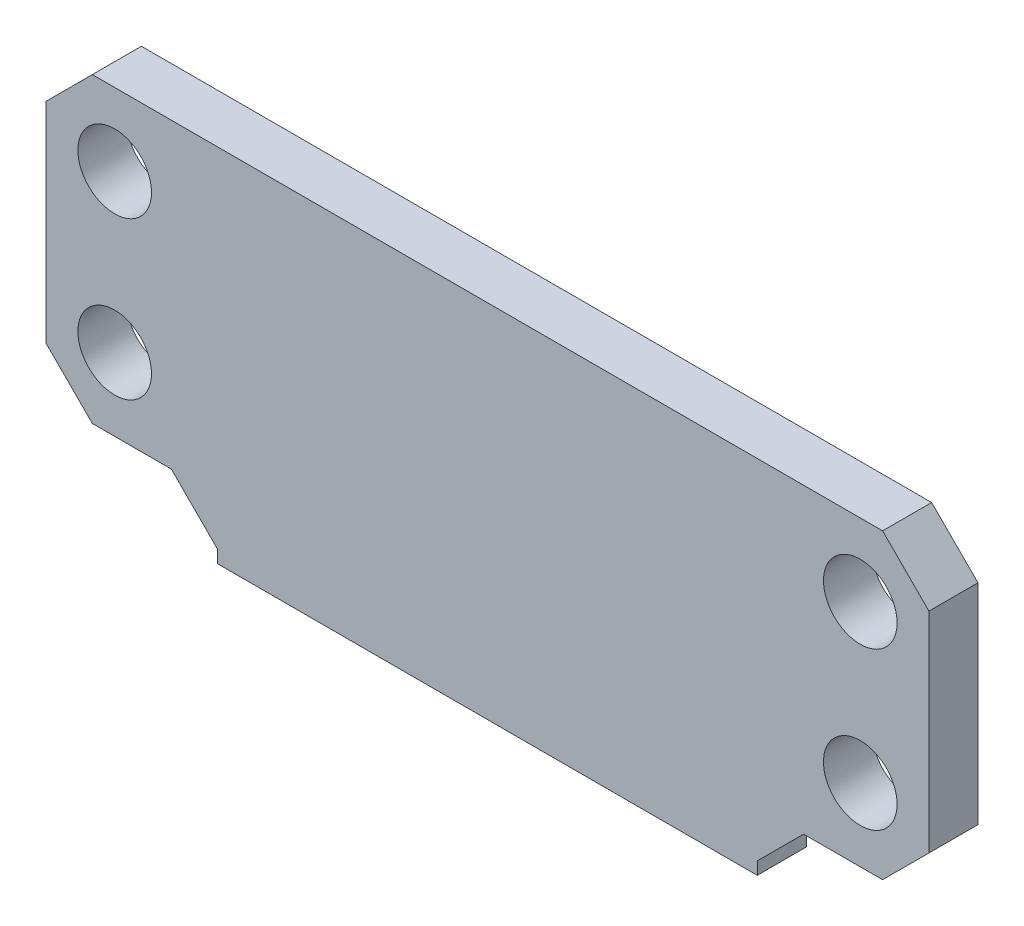
ISO-10303-21;
HEADER;
FILE_DESCRIPTION(('STEP AP214'),'2;1');
FILE_NAME('part.step','',(''),(''),'','','');
FILE_SCHEMA(('AUTOMOTIVE_DESIGN { 1 0 10303 214 1 1 1 1 }'));
ENDSEC;
DATA;
#1=APPLICATION_CONTEXT('core data for automotive mechanical design processes');
#2=APPLICATION_PROTOCOL_DEFINITION('international standard','automotive_design',2000,#1);
#3=PRODUCT_CONTEXT('',#1,'mechanical');
#4=PRODUCT('Part','Part','',(#3));
#5=PRODUCT_RELATED_PRODUCT_CATEGORY('part','',(#4));
#6=PRODUCT_DEFINITION_FORMATION('','',#4);
#7=PRODUCT_DEFINITION_CONTEXT('part definition',#1,'design');
#8=PRODUCT_DEFINITION('design','',#6,#7);
#9=PRODUCT_DEFINITION_SHAPE('','',#8);
#10=(LENGTH_UNIT() NAMED_UNIT(*) SI_UNIT(.MILLI.,.METRE.));
#11=(NAMED_UNIT(*) PLANE_ANGLE_UNIT() SI_UNIT($,.RADIAN.));
#12=(NAMED_UNIT(*) SI_UNIT($,.STERADIAN.) SOLID_ANGLE_UNIT());
#13=UNCERTAINTY_MEASURE_WITH_UNIT(LENGTH_MEASURE(1.E-05),#10,'distance_accuracy_value','');
#14=(GEOMETRIC_REPRESENTATION_CONTEXT(3) GLOBAL_UNCERTAINTY_ASSIGNED_CONTEXT((#13)) GLOBAL_UNIT_ASSIGNED_CONTEXT((#10,
#11,#12)) REPRESENTATION_CONTEXT('',''));
#15=CARTESIAN_POINT('',(0.,0.,0.));
#16=DIRECTION('',(0.,0.,1.));
#17=DIRECTION('',(1.,0.,0.));
#18=AXIS2_PLACEMENT_3D('',#15,#16,#17);
#19=CARTESIAN_POINT('',(0.,1.65099999999999,3.175));
#20=DIRECTION('',(0.,-1.,0.));
#21=DIRECTION('',(1.,0.,0.));
#22=AXIS2_PLACEMENT_3D('',#19,#20,#21);
#23=PLANE('',#22);
#24=DIRECTION('',(-1.,0.,0.));
#25=VECTOR('',#24,1.);
#26=CARTESIAN_POINT('',(0.,1.65099999999999,0.));
#27=LINE('',#26,#25);
#28=CARTESIAN_POINT('',(-20.4625,1.65099999999999,0.));
#29=VERTEX_POINT('',#28);
#30=CARTESIAN_POINT('',(-25.575,1.65099999999999,0.));
#31=VERTEX_POINT('',#30);
#32=EDGE_CURVE('E156',#29,#31,#27,.T.);
#33=ORIENTED_EDGE('',*,*,#32,.F.);
#34=DIRECTION('',(0.,0.,1.));
#35=VECTOR('',#34,1.);
#36=CARTESIAN_POINT('',(-20.4625,1.65099999999999,3.175));
#37=LINE('',#36,#35);
#38=CARTESIAN_POINT('',(-20.4625,1.65099999999999,3.175));
#39=VERTEX_POINT('',#38);
#40=EDGE_CURVE('E216',#29,#39,#37,.T.);
#41=ORIENTED_EDGE('',*,*,#40,.T.);
#42=DIRECTION('',(-1.,0.,0.));
#43=VECTOR('',#42,1.);
#44=CARTESIAN_POINT('',(0.,1.65099999999999,3.175));
#45=LINE('',#44,#43);
#46=CARTESIAN_POINT('',(-25.575,1.65099999999999,3.175));
#47=VERTEX_POINT('',#46);
#48=EDGE_CURVE('E234',#39,#47,#45,.T.);
#49=ORIENTED_EDGE('',*,*,#48,.T.);
#50=DIRECTION('',(0.,0.,-1.));
#51=VECTOR('',#50,1.);
#52=CARTESIAN_POINT('',(-25.575,1.65099999999999,3.175));
#53=LINE('',#52,#51);
#54=EDGE_CURVE('E205',#47,#31,#53,.T.);
#55=ORIENTED_EDGE('',*,*,#54,.T.);
#56=EDGE_LOOP('',(#33,#41,#49,#55));
#57=FACE_BOUND('',#56,.T.);
#58=ADVANCED_FACE('F32',(#57),#23,.T.);
#59=CARTESIAN_POINT('',(-17.4625,0.,3.175));
#60=DIRECTION('',(-1.,0.,0.));
#61=DIRECTION('',(0.,0.,1.));
#62=AXIS2_PLACEMENT_3D('',#59,#60,#61);
#63=PLANE('',#62);
#64=DIRECTION('',(0.,0.,-1.));
#65=VECTOR('',#64,1.);
#66=CARTESIAN_POINT('',(-17.4625,-2.15900000000001,3.175));
#67=LINE('',#66,#65);
#68=CARTESIAN_POINT('',(-17.4625,-2.15900000000001,3.175));
#69=VERTEX_POINT('',#68);
#70=CARTESIAN_POINT('',(-17.4625,-2.15900000000001,0.));
#71=VERTEX_POINT('',#70);
#72=EDGE_CURVE('E47',#69,#71,#67,.T.);
#73=ORIENTED_EDGE('',*,*,#72,.F.);
#74=DIRECTION('',(0.,1.,0.));
#75=VECTOR('',#74,1.);
#76=CARTESIAN_POINT('',(-17.4625,0.,3.175));
#77=LINE('',#76,#75);
#78=CARTESIAN_POINT('',(-17.4625,-1.34900000000003,3.175));
#79=VERTEX_POINT('',#78);
#80=EDGE_CURVE('E233',#69,#79,#77,.T.);
#81=ORIENTED_EDGE('',*,*,#80,.T.);
#82=DIRECTION('',(0.,0.,-1.));
#83=VECTOR('',#82,1.);
#84=CARTESIAN_POINT('',(-17.4625,-1.34900000000003,0.));
#85=LINE('',#84,#83);
#86=CARTESIAN_POINT('',(-17.4625,-1.34900000000003,0.));
#87=VERTEX_POINT('',#86);
#88=EDGE_CURVE('E213',#79,#87,#85,.T.);
#89=ORIENTED_EDGE('',*,*,#88,.T.);
#90=DIRECTION('',(0.,1.,0.));
#91=VECTOR('',#90,1.);
#92=CARTESIAN_POINT('',(-17.4625,0.,0.));
#93=LINE('',#92,#91);
#94=EDGE_CURVE('E152',#71,#87,#93,.T.);
#95=ORIENTED_EDGE('',*,*,#94,.F.);
#96=EDGE_LOOP('',(#73,#81,#89,#95));
#97=FACE_BOUND('',#96,.T.);
#98=ADVANCED_FACE('F240',(#97),#63,.T.);
#99=CARTESIAN_POINT('',(17.4625,0.,3.175));
#100=DIRECTION('',(-1.,0.,0.));
#101=DIRECTION('',(0.,-1.,0.));
#102=AXIS2_PLACEMENT_3D('',#99,#100,#101);
#103=PLANE('',#102);
#104=DIRECTION('',(0.,1.,0.));
#105=VECTOR('',#104,1.);
#106=CARTESIAN_POINT('',(17.4625,0.,3.175));
#107=LINE('',#106,#105);
#108=CARTESIAN_POINT('',(17.4625,-2.15900000000001,3.175));
#109=VERTEX_POINT('',#108);
#110=CARTESIAN_POINT('',(17.4625,-1.34900000000002,3.175));
#111=VERTEX_POINT('',#110);
#112=EDGE_CURVE('E145',#109,#111,#107,.T.);
#113=ORIENTED_EDGE('',*,*,#112,.F.);
#114=DIRECTION('',(0.,0.,-1.));
#115=VECTOR('',#114,1.);
#116=CARTESIAN_POINT('',(17.4625,-2.15900000000001,3.175));
#117=LINE('',#116,#115);
#118=CARTESIAN_POINT('',(17.4625,-2.15900000000001,0.));
#119=VERTEX_POINT('',#118);
#120=EDGE_CURVE('E132',#109,#119,#117,.T.);
#121=ORIENTED_EDGE('',*,*,#120,.T.);
#122=DIRECTION('',(0.,1.,0.));
#123=VECTOR('',#122,1.);
#124=CARTESIAN_POINT('',(17.4625,0.,0.));
#125=LINE('',#124,#123);
#126=CARTESIAN_POINT('',(17.4625,-1.34900000000002,0.));
#127=VERTEX_POINT('',#126);
#128=EDGE_CURVE('E143',#119,#127,#125,.T.);
#129=ORIENTED_EDGE('',*,*,#128,.T.);
#130=DIRECTION('',(0.,0.,1.));
#131=VECTOR('',#130,1.);
#132=CARTESIAN_POINT('',(17.4625,-1.34900000000002,3.175));
#133=LINE('',#132,#131);
#134=EDGE_CURVE('E221',#127,#111,#133,.T.);
#135=ORIENTED_EDGE('',*,*,#134,.T.);
#136=EDGE_LOOP('',(#113,#121,#129,#135));
#137=FACE_BOUND('',#136,.T.);
#138=ADVANCED_FACE('F141',(#137),#103,.F.);
#139=CARTESIAN_POINT('',(0.,1.651,3.175));
#140=DIRECTION('',(0.,-1.,0.));
#141=DIRECTION('',(1.,0.,0.));
#142=AXIS2_PLACEMENT_3D('',#139,#140,#141);
#143=PLANE('',#142);
#144=DIRECTION('',(-1.,0.,0.));
#145=VECTOR('',#144,1.);
#146=CARTESIAN_POINT('',(0.,1.651,3.175));
#147=LINE('',#146,#145);
#148=CARTESIAN_POINT('',(25.575,1.65099999999999,3.175));
#149=VERTEX_POINT('',#148);
#150=CARTESIAN_POINT('',(20.4625,1.65099999999999,3.175));
#151=VERTEX_POINT('',#150);
#152=EDGE_CURVE('E242',#149,#151,#147,.T.);
#153=ORIENTED_EDGE('',*,*,#152,.T.);
#154=DIRECTION('',(0.,0.,-1.));
#155=VECTOR('',#154,1.);
#156=CARTESIAN_POINT('',(20.4625,1.65099999999999,3.175));
#157=LINE('',#156,#155);
#158=CARTESIAN_POINT('',(20.4625,1.65099999999999,0.));
#159=VERTEX_POINT('',#158);
#160=EDGE_CURVE('E218',#151,#159,#157,.T.);
#161=ORIENTED_EDGE('',*,*,#160,.T.);
#162=DIRECTION('',(-1.,0.,0.));
#163=VECTOR('',#162,1.);
#164=CARTESIAN_POINT('',(0.,1.651,0.));
#165=LINE('',#164,#163);
#166=CARTESIAN_POINT('',(25.575,1.65099999999999,0.));
#167=VERTEX_POINT('',#166);
#168=EDGE_CURVE('E151',#167,#159,#165,.T.);
#169=ORIENTED_EDGE('',*,*,#168,.F.);
#170=DIRECTION('',(0.,0.,1.));
#171=VECTOR('',#170,1.);
#172=CARTESIAN_POINT('',(25.575,1.65099999999999,3.175));
#173=LINE('',#172,#171);
#174=EDGE_CURVE('E203',#167,#149,#173,.T.);
#175=ORIENTED_EDGE('',*,*,#174,.T.);
#176=EDGE_LOOP('',(#153,#161,#169,#175));
#177=FACE_BOUND('',#176,.T.);
#178=ADVANCED_FACE('F305',(#177),#143,.T.);
#179=CARTESIAN_POINT('',(28.575,0.,3.175));
#180=DIRECTION('',(-1.,0.,0.));
#181=DIRECTION('',(0.,0.,1.));
#182=AXIS2_PLACEMENT_3D('',#179,#180,#181);
#183=PLANE('',#182);
#184=DIRECTION('',(0.,1.,0.));
#185=VECTOR('',#184,1.);
#186=CARTESIAN_POINT('',(28.575,0.,0.));
#187=LINE('',#186,#185);
#188=CARTESIAN_POINT('',(28.575,4.65099999999997,0.));
#189=VERTEX_POINT('',#188);
#190=CARTESIAN_POINT('',(28.575,18.209,0.));
#191=VERTEX_POINT('',#190);
#192=EDGE_CURVE('E154',#189,#191,#187,.T.);
#193=ORIENTED_EDGE('',*,*,#192,.T.);
#194=DIRECTION('',(0.,0.,1.));
#195=VECTOR('',#194,1.);
#196=CARTESIAN_POINT('',(28.575,18.209,3.175));
#197=LINE('',#196,#195);
#198=CARTESIAN_POINT('',(28.575,18.209,3.175));
#199=VERTEX_POINT('',#198);
#200=EDGE_CURVE('E192',#191,#199,#197,.T.);
#201=ORIENTED_EDGE('',*,*,#200,.T.);
#202=DIRECTION('',(0.,1.,0.));
#203=VECTOR('',#202,1.);
#204=CARTESIAN_POINT('',(28.575,0.,3.175));
#205=LINE('',#204,#203);
#206=CARTESIAN_POINT('',(28.575,4.65099999999998,3.175));
#207=VERTEX_POINT('',#206);
#208=EDGE_CURVE('E249',#207,#199,#205,.T.);
#209=ORIENTED_EDGE('',*,*,#208,.F.);
#210=DIRECTION('',(0.,0.,-1.));
#211=VECTOR('',#210,1.);
#212=CARTESIAN_POINT('',(28.575,4.65099999999997,0.));
#213=LINE('',#212,#211);
#214=EDGE_CURVE('E189',#207,#189,#213,.T.);
#215=ORIENTED_EDGE('',*,*,#214,.T.);
#216=EDGE_LOOP('',(#193,#201,#209,#215));
#217=FACE_BOUND('',#216,.T.);
#218=ADVANCED_FACE('F296',(#217),#183,.F.);
#219=CARTESIAN_POINT('',(0.,21.209,3.175));
#220=DIRECTION('',(0.,-1.,0.));
#221=DIRECTION('',(0.,0.,-1.));
#222=AXIS2_PLACEMENT_3D('',#219,#220,#221);
#223=PLANE('',#222);
#224=DIRECTION('',(-1.,0.,0.));
#225=VECTOR('',#224,1.);
#226=CARTESIAN_POINT('',(0.,21.209,3.175));
#227=LINE('',#226,#225);
#228=CARTESIAN_POINT('',(25.575,21.209,3.175));
#229=VERTEX_POINT('',#228);
#230=CARTESIAN_POINT('',(-25.575,21.209,3.175));
#231=VERTEX_POINT('',#230);
#232=EDGE_CURVE('E252',#229,#231,#227,.T.);
#233=ORIENTED_EDGE('',*,*,#232,.F.);
#234=DIRECTION('',(0.,0.,-1.));
#235=VECTOR('',#234,1.);
#236=CARTESIAN_POINT('',(25.575,21.209,3.175));
#237=LINE('',#236,#235);
#238=CARTESIAN_POINT('',(25.575,21.209,0.));
#239=VERTEX_POINT('',#238);
#240=EDGE_CURVE('E177',#229,#239,#237,.T.);
#241=ORIENTED_EDGE('',*,*,#240,.T.);
#242=DIRECTION('',(-1.,0.,0.));
#243=VECTOR('',#242,1.);
#244=CARTESIAN_POINT('',(0.,21.209,0.));
#245=LINE('',#244,#243);
#246=CARTESIAN_POINT('',(-25.575,21.209,0.));
#247=VERTEX_POINT('',#246);
#248=EDGE_CURVE('E162',#239,#247,#245,.T.);
#249=ORIENTED_EDGE('',*,*,#248,.T.);
#250=DIRECTION('',(0.,0.,1.));
#251=VECTOR('',#250,1.);
#252=CARTESIAN_POINT('',(-25.575,21.209,3.175));
#253=LINE('',#252,#251);
#254=EDGE_CURVE('E175',#247,#231,#253,.T.);
#255=ORIENTED_EDGE('',*,*,#254,.T.);
#256=EDGE_LOOP('',(#233,#241,#249,#255));
#257=FACE_BOUND('',#256,.T.);
#258=ADVANCED_FACE('F288',(#257),#223,.F.);
#259=CARTESIAN_POINT('',(24.13,16.51,3.175));
#260=DIRECTION('',(0.,0.,-1.));
#261=DIRECTION('',(-1.,0.,0.));
#262=AXIS2_PLACEMENT_3D('',#259,#260,#261);
#263=CYLINDRICAL_SURFACE('',#262,2.3828);
#264=CARTESIAN_POINT('',(24.13,16.51,3.175));
#265=DIRECTION('',(0.,0.,1.));
#266=DIRECTION('',(1.,0.,0.));
#267=AXIS2_PLACEMENT_3D('',#264,#265,#266);
#268=CIRCLE('',#267,2.3828);
#269=CARTESIAN_POINT('',(26.5128,16.51,3.175));
#270=VERTEX_POINT('',#269);
#271=EDGE_CURVE('E258',#270,#270,#268,.T.);
#272=ORIENTED_EDGE('',*,*,#271,.T.);
#273=EDGE_LOOP('',(#272));
#274=FACE_BOUND('',#273,.T.);
#275=CARTESIAN_POINT('',(24.13,16.51,0.));
#276=DIRECTION('',(0.,0.,1.));
#277=DIRECTION('',(1.,0.,0.));
#278=AXIS2_PLACEMENT_3D('',#275,#276,#277);
#279=CIRCLE('',#278,2.3828);
#280=CARTESIAN_POINT('',(26.5128,16.51,0.));
#281=VERTEX_POINT('',#280);
#282=EDGE_CURVE('E168',#281,#281,#279,.T.);
#283=ORIENTED_EDGE('',*,*,#282,.F.);
#284=EDGE_LOOP('',(#283));
#285=FACE_BOUND('',#284,.T.);
#286=ADVANCED_FACE('F420',(#274,#285),#263,.F.);
#287=CARTESIAN_POINT('',(-28.575,0.,3.175));
#288=DIRECTION('',(-1.,0.,0.));
#289=DIRECTION('',(0.,0.,1.));
#290=AXIS2_PLACEMENT_3D('',#287,#288,#289);
#291=PLANE('',#290);
#292=DIRECTION('',(0.,1.,0.));
#293=VECTOR('',#292,1.);
#294=CARTESIAN_POINT('',(-28.575,0.,0.));
#295=LINE('',#294,#293);
#296=CARTESIAN_POINT('',(-28.575,4.651,0.));
#297=VERTEX_POINT('',#296);
#298=CARTESIAN_POINT('',(-28.575,18.209,0.));
#299=VERTEX_POINT('',#298);
#300=EDGE_CURVE('E165',#297,#299,#295,.T.);
#301=ORIENTED_EDGE('',*,*,#300,.F.);
#302=DIRECTION('',(0.,0.,1.));
#303=VECTOR('',#302,1.);
#304=CARTESIAN_POINT('',(-28.575,4.651,3.175));
#305=LINE('',#304,#303);
#306=CARTESIAN_POINT('',(-28.575,4.65100000000001,3.175));
#307=VERTEX_POINT('',#306);
#308=EDGE_CURVE('E211',#297,#307,#305,.T.);
#309=ORIENTED_EDGE('',*,*,#308,.T.);
#310=DIRECTION('',(0.,1.,0.));
#311=VECTOR('',#310,1.);
#312=CARTESIAN_POINT('',(-28.575,0.,3.175));
#313=LINE('',#312,#311);
#314=CARTESIAN_POINT('',(-28.575,18.209,3.175));
#315=VERTEX_POINT('',#314);
#316=EDGE_CURVE('E255',#307,#315,#313,.T.);
#317=ORIENTED_EDGE('',*,*,#316,.T.);
#318=DIRECTION('',(0.,0.,-1.));
#319=VECTOR('',#318,1.);
#320=CARTESIAN_POINT('',(-28.575,18.209,0.));
#321=LINE('',#320,#319);
#322=EDGE_CURVE('E208',#315,#299,#321,.T.);
#323=ORIENTED_EDGE('',*,*,#322,.T.);
#324=EDGE_LOOP('',(#301,#309,#317,#323));
#325=FACE_BOUND('',#324,.T.);
#326=ADVANCED_FACE('F281',(#325),#291,.T.);
#327=CARTESIAN_POINT('',(-24.13,6.34999999999999,3.175));
#328=DIRECTION('',(0.,0.,-1.));
#329=DIRECTION('',(-1.,0.,0.));
#330=AXIS2_PLACEMENT_3D('',#327,#328,#329);
#331=CYLINDRICAL_SURFACE('',#330,2.3828);
#332=CARTESIAN_POINT('',(-24.13,6.34999999999999,3.175));
#333=DIRECTION('',(0.,0.,1.));
#334=DIRECTION('',(1.,0.,0.));
#335=AXIS2_PLACEMENT_3D('',#332,#333,#334);
#336=CIRCLE('',#335,2.3828);
#337=CARTESIAN_POINT('',(-21.7472,6.34999999999999,3.175));
#338=VERTEX_POINT('',#337);
#339=EDGE_CURVE('E244',#338,#338,#336,.T.);
#340=ORIENTED_EDGE('',*,*,#339,.T.);
#341=EDGE_LOOP('',(#340));
#342=FACE_BOUND('',#341,.T.);
#343=CARTESIAN_POINT('',(-24.13,6.34999999999999,0.));
#344=DIRECTION('',(0.,0.,1.));
#345=DIRECTION('',(1.,0.,0.));
#346=AXIS2_PLACEMENT_3D('',#343,#344,#345);
#347=CIRCLE('',#346,2.3828);
#348=CARTESIAN_POINT('',(-21.7472,6.34999999999999,0.));
#349=VERTEX_POINT('',#348);
#350=EDGE_CURVE('E266',#349,#349,#347,.T.);
#351=ORIENTED_EDGE('',*,*,#350,.F.);
#352=EDGE_LOOP('',(#351));
#353=FACE_BOUND('',#352,.T.);
#354=ADVANCED_FACE('F322',(#342,#353),#331,.F.);
#355=CARTESIAN_POINT('',(-24.13,16.51,3.175));
#356=DIRECTION('',(0.,0.,-1.));
#357=DIRECTION('',(-1.,0.,0.));
#358=AXIS2_PLACEMENT_3D('',#355,#356,#357);
#359=CYLINDRICAL_SURFACE('',#358,2.3828);
#360=CARTESIAN_POINT('',(-24.13,16.51,3.175));
#361=DIRECTION('',(0.,0.,1.));
#362=DIRECTION('',(1.,0.,0.));
#363=AXIS2_PLACEMENT_3D('',#360,#361,#362);
#364=CIRCLE('',#363,2.3828);
#365=CARTESIAN_POINT('',(-21.7472,16.51,3.175));
#366=VERTEX_POINT('',#365);
#367=EDGE_CURVE('E174',#366,#366,#364,.F.);
#368=ORIENTED_EDGE('',*,*,#367,.F.);
#369=EDGE_LOOP('',(#368));
#370=FACE_BOUND('',#369,.T.);
#371=CARTESIAN_POINT('',(-24.13,16.51,0.));
#372=DIRECTION('',(0.,0.,1.));
#373=DIRECTION('',(1.,0.,0.));
#374=AXIS2_PLACEMENT_3D('',#371,#372,#373);
#375=CIRCLE('',#374,2.3828);
#376=CARTESIAN_POINT('',(-21.7472,16.51,0.));
#377=VERTEX_POINT('',#376);
#378=EDGE_CURVE('E263',#377,#377,#375,.F.);
#379=ORIENTED_EDGE('',*,*,#378,.T.);
#380=EDGE_LOOP('',(#379));
#381=FACE_BOUND('',#380,.T.);
#382=ADVANCED_FACE('F325',(#370,#381),#359,.F.);
#383=CARTESIAN_POINT('',(24.13,6.34999999999999,3.175));
#384=DIRECTION('',(0.,0.,-1.));
#385=DIRECTION('',(-1.,0.,0.));
#386=AXIS2_PLACEMENT_3D('',#383,#384,#385);
#387=CYLINDRICAL_SURFACE('',#386,2.3828);
#388=CARTESIAN_POINT('',(24.13,6.34999999999999,3.175));
#389=DIRECTION('',(0.,0.,1.));
#390=DIRECTION('',(1.,0.,0.));
#391=AXIS2_PLACEMENT_3D('',#388,#389,#390);
#392=CIRCLE('',#391,2.3828);
#393=CARTESIAN_POINT('',(26.5128,6.34999999999999,3.175));
#394=VERTEX_POINT('',#393);
#395=EDGE_CURVE('E178',#394,#394,#392,.F.);
#396=ORIENTED_EDGE('',*,*,#395,.F.);
#397=EDGE_LOOP('',(#396));
#398=FACE_BOUND('',#397,.T.);
#399=CARTESIAN_POINT('',(24.13,6.34999999999999,0.));
#400=DIRECTION('',(0.,0.,1.));
#401=DIRECTION('',(1.,0.,0.));
#402=AXIS2_PLACEMENT_3D('',#399,#400,#401);
#403=CIRCLE('',#402,2.3828);
#404=CARTESIAN_POINT('',(26.5128,6.34999999999999,0.));
#405=VERTEX_POINT('',#404);
#406=EDGE_CURVE('E171',#405,#405,#403,.F.);
#407=ORIENTED_EDGE('',*,*,#406,.T.);
#408=EDGE_LOOP('',(#407));
#409=FACE_BOUND('',#408,.T.);
#410=ADVANCED_FACE('F329',(#398,#409),#387,.F.);
#411=CARTESIAN_POINT('',(0.,0.,3.175));
#412=DIRECTION('',(0.,0.,1.));
#413=DIRECTION('',(1.,0.,0.));
#414=AXIS2_PLACEMENT_3D('',#411,#412,#413);
#415=PLANE('',#414);
#416=DIRECTION('',(1.,0.,0.));
#417=VECTOR('',#416,1.);
#418=CARTESIAN_POINT('',(17.7176073900927,-2.15900000000001,3.175));
#419=LINE('',#418,#417);
#420=EDGE_CURVE('E137',#69,#109,#419,.T.);
#421=ORIENTED_EDGE('',*,*,#420,.T.);
#422=ORIENTED_EDGE('',*,*,#112,.T.);
#423=DIRECTION('',(0.707106781186551,0.707106781186544,0.));
#424=VECTOR('',#423,1.);
#425=CARTESIAN_POINT('',(20.4625,1.65099999999999,3.175));
#426=LINE('',#425,#424);
#427=EDGE_CURVE('E11',#111,#151,#426,.T.);
#428=ORIENTED_EDGE('',*,*,#427,.T.);
#429=ORIENTED_EDGE('',*,*,#152,.F.);
#430=DIRECTION('',(0.707106781186549,0.707106781186546,0.));
#431=VECTOR('',#430,1.);
#432=CARTESIAN_POINT('',(11.9619999999999,-11.962,3.175));
#433=LINE('',#432,#431);
#434=EDGE_CURVE('E199',#149,#207,#433,.T.);
#435=ORIENTED_EDGE('',*,*,#434,.T.);
#436=ORIENTED_EDGE('',*,*,#208,.T.);
#437=DIRECTION('',(0.707106781186547,-0.707106781186548,0.));
#438=VECTOR('',#437,1.);
#439=CARTESIAN_POINT('',(23.392,23.392,3.175));
#440=LINE('',#439,#438);
#441=EDGE_CURVE('E201',#199,#229,#440,.F.);
#442=ORIENTED_EDGE('',*,*,#441,.T.);
#443=ORIENTED_EDGE('',*,*,#232,.T.);
#444=DIRECTION('',(-0.707106781186548,-0.707106781186547,0.));
#445=VECTOR('',#444,1.);
#446=CARTESIAN_POINT('',(-23.392,23.392,3.175));
#447=LINE('',#446,#445);
#448=EDGE_CURVE('E194',#231,#315,#447,.T.);
#449=ORIENTED_EDGE('',*,*,#448,.T.);
#450=ORIENTED_EDGE('',*,*,#316,.F.);
#451=DIRECTION('',(-0.707106781186546,0.707106781186549,0.));
#452=VECTOR('',#451,1.);
#453=CARTESIAN_POINT('',(-11.9620000000001,-11.962,3.175));
#454=LINE('',#453,#452);
#455=EDGE_CURVE('E196',#307,#47,#454,.F.);
#456=ORIENTED_EDGE('',*,*,#455,.T.);
#457=ORIENTED_EDGE('',*,*,#48,.F.);
#458=DIRECTION('',(-0.707106781186543,0.707106781186552,0.));
#459=VECTOR('',#458,1.);
#460=CARTESIAN_POINT('',(-17.4625,-1.34900000000003,3.175));
#461=LINE('',#460,#459);
#462=EDGE_CURVE('E225',#39,#79,#461,.F.);
#463=ORIENTED_EDGE('',*,*,#462,.T.);
#464=ORIENTED_EDGE('',*,*,#80,.F.);
#465=EDGE_LOOP('',(#421,#422,#428,#429,#435,#436,#442,#443,#449,#450,#456,#457,#463,#464));
#466=FACE_BOUND('',#465,.T.);
#467=ORIENTED_EDGE('',*,*,#367,.T.);
#468=EDGE_LOOP('',(#467));
#469=FACE_BOUND('',#468,.T.);
#470=ORIENTED_EDGE('',*,*,#339,.F.);
#471=EDGE_LOOP('',(#470));
#472=FACE_BOUND('',#471,.T.);
#473=ORIENTED_EDGE('',*,*,#271,.F.);
#474=EDGE_LOOP('',(#473));
#475=FACE_BOUND('',#474,.T.);
#476=ORIENTED_EDGE('',*,*,#395,.T.);
#477=EDGE_LOOP('',(#476));
#478=FACE_BOUND('',#477,.T.);
#479=ADVANCED_FACE('F231',(#466,#469,#472,#475,#478),#415,.T.);
#480=CARTESIAN_POINT('',(0.,0.,0.));
#481=DIRECTION('',(0.,0.,1.));
#482=DIRECTION('',(1.,0.,0.));
#483=AXIS2_PLACEMENT_3D('',#480,#481,#482);
#484=PLANE('',#483);
#485=ORIENTED_EDGE('',*,*,#378,.F.);
#486=EDGE_LOOP('',(#485));
#487=FACE_BOUND('',#486,.T.);
#488=ORIENTED_EDGE('',*,*,#350,.T.);
#489=EDGE_LOOP('',(#488));
#490=FACE_BOUND('',#489,.T.);
#491=ORIENTED_EDGE('',*,*,#128,.F.);
#492=DIRECTION('',(1.,0.,0.));
#493=VECTOR('',#492,1.);
#494=CARTESIAN_POINT('',(17.7176073900927,-2.15900000000001,0.));
#495=LINE('',#494,#493);
#496=EDGE_CURVE('E129',#71,#119,#495,.T.);
#497=ORIENTED_EDGE('',*,*,#496,.F.);
#498=ORIENTED_EDGE('',*,*,#94,.T.);
#499=DIRECTION('',(0.707106781186543,-0.707106781186552,0.));
#500=VECTOR('',#499,1.);
#501=CARTESIAN_POINT('',(-9.40575000000011,-9.40575,0.));
#502=LINE('',#501,#500);
#503=EDGE_CURVE('E223',#87,#29,#502,.F.);
#504=ORIENTED_EDGE('',*,*,#503,.T.);
#505=ORIENTED_EDGE('',*,*,#32,.T.);
#506=DIRECTION('',(0.707106781186546,-0.707106781186549,0.));
#507=VECTOR('',#506,1.);
#508=CARTESIAN_POINT('',(-25.575,1.65099999999999,0.));
#509=LINE('',#508,#507);
#510=EDGE_CURVE('E183',#31,#297,#509,.F.);
#511=ORIENTED_EDGE('',*,*,#510,.T.);
#512=ORIENTED_EDGE('',*,*,#300,.T.);
#513=DIRECTION('',(0.707106781186548,0.707106781186547,0.));
#514=VECTOR('',#513,1.);
#515=CARTESIAN_POINT('',(-28.575,18.209,0.));
#516=LINE('',#515,#514);
#517=EDGE_CURVE('E181',#299,#247,#516,.T.);
#518=ORIENTED_EDGE('',*,*,#517,.T.);
#519=ORIENTED_EDGE('',*,*,#248,.F.);
#520=DIRECTION('',(-0.707106781186547,0.707106781186548,0.));
#521=VECTOR('',#520,1.);
#522=CARTESIAN_POINT('',(25.575,21.209,0.));
#523=LINE('',#522,#521);
#524=EDGE_CURVE('E187',#239,#191,#523,.F.);
#525=ORIENTED_EDGE('',*,*,#524,.T.);
#526=ORIENTED_EDGE('',*,*,#192,.F.);
#527=DIRECTION('',(-0.707106781186549,-0.707106781186546,0.));
#528=VECTOR('',#527,1.);
#529=CARTESIAN_POINT('',(28.575,4.65099999999997,0.));
#530=LINE('',#529,#528);
#531=EDGE_CURVE('E185',#189,#167,#530,.T.);
#532=ORIENTED_EDGE('',*,*,#531,.T.);
#533=ORIENTED_EDGE('',*,*,#168,.T.);
#534=DIRECTION('',(-0.707106781186551,-0.707106781186544,0.));
#535=VECTOR('',#534,1.);
#536=CARTESIAN_POINT('',(9.40574999999992,-9.40575000000001,0.));
#537=LINE('',#536,#535);
#538=EDGE_CURVE('E40',#159,#127,#537,.T.);
#539=ORIENTED_EDGE('',*,*,#538,.T.);
#540=EDGE_LOOP('',(#491,#497,#498,#504,#505,#511,#512,#518,#519,#525,#526,#532,#533,#539));
#541=FACE_BOUND('',#540,.T.);
#542=ORIENTED_EDGE('',*,*,#282,.T.);
#543=EDGE_LOOP('',(#542));
#544=FACE_BOUND('',#543,.T.);
#545=ORIENTED_EDGE('',*,*,#406,.F.);
#546=EDGE_LOOP('',(#545));
#547=FACE_BOUND('',#546,.T.);
#548=ADVANCED_FACE('F147',(#487,#490,#541,#544,#547),#484,.F.);
#549=CARTESIAN_POINT('',(25.575,21.209,3.175));
#550=DIRECTION('',(-0.707106781186548,-0.707106781186547,0.));
#551=DIRECTION('',(0.,0.,-1.));
#552=AXIS2_PLACEMENT_3D('',#549,#550,#551);
#553=PLANE('',#552);
#554=ORIENTED_EDGE('',*,*,#441,.F.);
#555=ORIENTED_EDGE('',*,*,#200,.F.);
#556=ORIENTED_EDGE('',*,*,#524,.F.);
#557=ORIENTED_EDGE('',*,*,#240,.F.);
#558=EDGE_LOOP('',(#554,#555,#556,#557));
#559=FACE_BOUND('',#558,.T.);
#560=ADVANCED_FACE('F292',(#559),#553,.F.);
#561=CARTESIAN_POINT('',(28.575,4.65099999999997,3.175));
#562=DIRECTION('',(0.707106781186546,-0.707106781186549,0.));
#563=DIRECTION('',(0.,0.,1.));
#564=AXIS2_PLACEMENT_3D('',#561,#562,#563);
#565=PLANE('',#564);
#566=ORIENTED_EDGE('',*,*,#434,.F.);
#567=ORIENTED_EDGE('',*,*,#174,.F.);
#568=ORIENTED_EDGE('',*,*,#531,.F.);
#569=ORIENTED_EDGE('',*,*,#214,.F.);
#570=EDGE_LOOP('',(#566,#567,#568,#569));
#571=FACE_BOUND('',#570,.T.);
#572=ADVANCED_FACE('F301',(#571),#565,.T.);
#573=CARTESIAN_POINT('',(-25.575,1.65099999999999,3.175));
#574=DIRECTION('',(0.707106781186549,0.707106781186546,0.));
#575=DIRECTION('',(0.,0.,-1.));
#576=AXIS2_PLACEMENT_3D('',#573,#574,#575);
#577=PLANE('',#576);
#578=ORIENTED_EDGE('',*,*,#455,.F.);
#579=ORIENTED_EDGE('',*,*,#308,.F.);
#580=ORIENTED_EDGE('',*,*,#510,.F.);
#581=ORIENTED_EDGE('',*,*,#54,.F.);
#582=EDGE_LOOP('',(#578,#579,#580,#581));
#583=FACE_BOUND('',#582,.T.);
#584=ADVANCED_FACE('F276',(#583),#577,.F.);
#585=CARTESIAN_POINT('',(-28.575,18.209,3.175));
#586=DIRECTION('',(-0.707106781186547,0.707106781186548,0.));
#587=DIRECTION('',(0.,0.,1.));
#588=AXIS2_PLACEMENT_3D('',#585,#586,#587);
#589=PLANE('',#588);
#590=ORIENTED_EDGE('',*,*,#448,.F.);
#591=ORIENTED_EDGE('',*,*,#254,.F.);
#592=ORIENTED_EDGE('',*,*,#517,.F.);
#593=ORIENTED_EDGE('',*,*,#322,.F.);
#594=EDGE_LOOP('',(#590,#591,#592,#593));
#595=FACE_BOUND('',#594,.T.);
#596=ADVANCED_FACE('F283',(#595),#589,.T.);
#597=CARTESIAN_POINT('',(-17.4625,-1.34900000000003,3.175));
#598=DIRECTION('',(-0.707106781186552,-0.707106781186543,0.));
#599=DIRECTION('',(0.,0.,1.));
#600=AXIS2_PLACEMENT_3D('',#597,#598,#599);
#601=PLANE('',#600);
#602=ORIENTED_EDGE('',*,*,#462,.F.);
#603=ORIENTED_EDGE('',*,*,#40,.F.);
#604=ORIENTED_EDGE('',*,*,#503,.F.);
#605=ORIENTED_EDGE('',*,*,#88,.F.);
#606=EDGE_LOOP('',(#602,#603,#604,#605));
#607=FACE_BOUND('',#606,.T.);
#608=ADVANCED_FACE('F238',(#607),#601,.T.);
#609=CARTESIAN_POINT('',(20.4625,1.65099999999999,3.175));
#610=DIRECTION('',(-0.707106781186544,0.707106781186551,0.));
#611=DIRECTION('',(0.,0.,-1.));
#612=AXIS2_PLACEMENT_3D('',#609,#610,#611);
#613=PLANE('',#612);
#614=ORIENTED_EDGE('',*,*,#427,.F.);
#615=ORIENTED_EDGE('',*,*,#134,.F.);
#616=ORIENTED_EDGE('',*,*,#538,.F.);
#617=ORIENTED_EDGE('',*,*,#160,.F.);
#618=EDGE_LOOP('',(#614,#615,#616,#617));
#619=FACE_BOUND('',#618,.T.);
#620=ADVANCED_FACE('F34',(#619),#613,.F.);
#621=CARTESIAN_POINT('',(17.7176073900927,-2.15900000000001,3.175));
#622=DIRECTION('',(0.,1.,0.));
#623=DIRECTION('',(0.,0.,1.));
#624=AXIS2_PLACEMENT_3D('',#621,#622,#623);
#625=PLANE('',#624);
#626=ORIENTED_EDGE('',*,*,#72,.T.);
#627=ORIENTED_EDGE('',*,*,#496,.T.);
#628=ORIENTED_EDGE('',*,*,#120,.F.);
#629=ORIENTED_EDGE('',*,*,#420,.F.);
#630=EDGE_LOOP('',(#626,#627,#628,#629));
#631=FACE_BOUND('',#630,.T.);
#632=ADVANCED_FACE('F131',(#631),#625,.F.);
#633=CLOSED_SHELL('',(#58,#98,#138,#178,#218,#258,#286,#326,#354,#382,#410,#479,#548,#560,#572,
#584,#596,#608,#620,#632));
#634=MANIFOLD_SOLID_BREP('B2',#633);
#635=ADVANCED_BREP_SHAPE_REPRESENTATION('',(#18,#634),#14);
#636=SHAPE_DEFINITION_REPRESENTATION(#9,#635);
ENDSEC;
END-ISO-10303-21;
